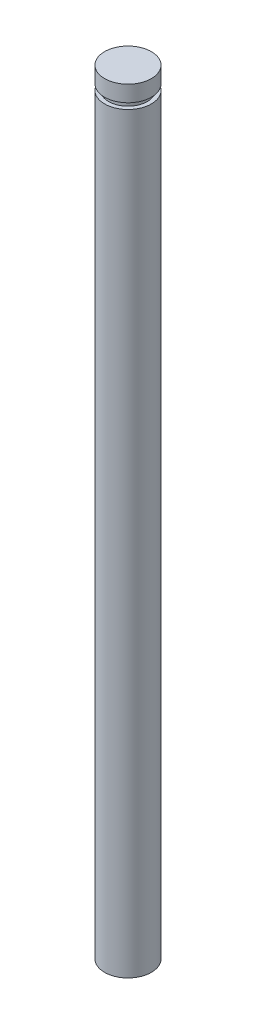
ISO-10303-21;
HEADER;
FILE_DESCRIPTION(('STEP AP214'),'2;1');
FILE_NAME('part.step','',(''),(''),'','','');
FILE_SCHEMA(('AUTOMOTIVE_DESIGN { 1 0 10303 214 1 1 1 1 }'));
ENDSEC;
DATA;
#1=APPLICATION_CONTEXT('core data for automotive mechanical design processes');
#2=APPLICATION_PROTOCOL_DEFINITION('international standard','automotive_design',2000,#1);
#3=PRODUCT_CONTEXT('',#1,'mechanical');
#4=PRODUCT('Part','Part','',(#3));
#5=PRODUCT_RELATED_PRODUCT_CATEGORY('part','',(#4));
#6=PRODUCT_DEFINITION_FORMATION('','',#4);
#7=PRODUCT_DEFINITION_CONTEXT('part definition',#1,'design');
#8=PRODUCT_DEFINITION('design','',#6,#7);
#9=PRODUCT_DEFINITION_SHAPE('','',#8);
#10=(LENGTH_UNIT() NAMED_UNIT(*) SI_UNIT(.MILLI.,.METRE.));
#11=(NAMED_UNIT(*) PLANE_ANGLE_UNIT() SI_UNIT($,.RADIAN.));
#12=(NAMED_UNIT(*) SI_UNIT($,.STERADIAN.) SOLID_ANGLE_UNIT());
#13=UNCERTAINTY_MEASURE_WITH_UNIT(LENGTH_MEASURE(1.E-05),#10,'distance_accuracy_value','');
#14=(GEOMETRIC_REPRESENTATION_CONTEXT(3) GLOBAL_UNCERTAINTY_ASSIGNED_CONTEXT((#13)) GLOBAL_UNIT_ASSIGNED_CONTEXT((#10,
#11,#12)) REPRESENTATION_CONTEXT('',''));
#15=CARTESIAN_POINT('',(0.,0.,0.));
#16=DIRECTION('',(0.,0.,1.));
#17=DIRECTION('',(1.,0.,0.));
#18=AXIS2_PLACEMENT_3D('',#15,#16,#17);
#19=CARTESIAN_POINT('',(0.,23.32,0.));
#20=DIRECTION('',(0.,1.,0.));
#21=DIRECTION('',(0.,0.,1.));
#22=AXIS2_PLACEMENT_3D('',#19,#20,#21);
#23=CYLINDRICAL_SURFACE('',#22,0.6);
#24=CARTESIAN_POINT('',(0.,23.32,0.));
#25=DIRECTION('',(0.,1.,0.));
#26=DIRECTION('',(0.,0.,1.));
#27=AXIS2_PLACEMENT_3D('',#24,#25,#26);
#28=CIRCLE('',#27,0.6);
#29=CARTESIAN_POINT('',(0.,23.32,0.6));
#30=VERTEX_POINT('',#29);
#31=EDGE_CURVE('E46',#30,#30,#28,.T.);
#32=ORIENTED_EDGE('',*,*,#31,.T.);
#33=EDGE_LOOP('',(#32));
#34=FACE_BOUND('',#33,.T.);
#35=CARTESIAN_POINT('',(0.,23.5,0.));
#36=DIRECTION('',(0.,1.,0.));
#37=DIRECTION('',(0.,0.,1.));
#38=AXIS2_PLACEMENT_3D('',#35,#36,#37);
#39=CIRCLE('',#38,0.6);
#40=CARTESIAN_POINT('',(0.,23.5,0.6));
#41=VERTEX_POINT('',#40);
#42=EDGE_CURVE('E56',#41,#41,#39,.T.);
#43=ORIENTED_EDGE('',*,*,#42,.F.);
#44=EDGE_LOOP('',(#43));
#45=FACE_BOUND('',#44,.T.);
#46=ADVANCED_FACE('F35',(#34,#45),#23,.T.);
#47=CARTESIAN_POINT('',(0.,24.,0.));
#48=DIRECTION('',(0.,-1.,0.));
#49=DIRECTION('',(0.,0.,-1.));
#50=AXIS2_PLACEMENT_3D('',#47,#48,#49);
#51=CYLINDRICAL_SURFACE('',#50,0.725);
#52=CARTESIAN_POINT('',(0.,0.,0.));
#53=DIRECTION('',(0.,1.,0.));
#54=DIRECTION('',(0.,0.,1.));
#55=AXIS2_PLACEMENT_3D('',#52,#53,#54);
#56=CIRCLE('',#55,0.725);
#57=CARTESIAN_POINT('',(0.,0.,0.725));
#58=VERTEX_POINT('',#57);
#59=EDGE_CURVE('E10',#58,#58,#56,.T.);
#60=ORIENTED_EDGE('',*,*,#59,.T.);
#61=EDGE_LOOP('',(#60));
#62=FACE_BOUND('',#61,.T.);
#63=CARTESIAN_POINT('',(0.,23.32,0.));
#64=DIRECTION('',(0.,1.,0.));
#65=DIRECTION('',(0.,0.,1.));
#66=AXIS2_PLACEMENT_3D('',#63,#64,#65);
#67=CIRCLE('',#66,0.725);
#68=CARTESIAN_POINT('',(0.,23.32,0.725));
#69=VERTEX_POINT('',#68);
#70=EDGE_CURVE('E42',#69,#69,#67,.T.);
#71=ORIENTED_EDGE('',*,*,#70,.F.);
#72=EDGE_LOOP('',(#71));
#73=FACE_BOUND('',#72,.T.);
#74=ADVANCED_FACE('F37',(#62,#73),#51,.T.);
#75=CARTESIAN_POINT('',(0.,0.,0.));
#76=DIRECTION('',(0.,1.,0.));
#77=DIRECTION('',(0.,0.,1.));
#78=AXIS2_PLACEMENT_3D('',#75,#76,#77);
#79=PLANE('',#78);
#80=ORIENTED_EDGE('',*,*,#59,.F.);
#81=EDGE_LOOP('',(#80));
#82=FACE_BOUND('',#81,.T.);
#83=ADVANCED_FACE('F71',(#82),#79,.F.);
#84=CARTESIAN_POINT('',(0.,23.32,0.));
#85=DIRECTION('',(0.,1.,0.));
#86=DIRECTION('',(0.,0.,1.));
#87=AXIS2_PLACEMENT_3D('',#84,#85,#86);
#88=PLANE('',#87);
#89=ORIENTED_EDGE('',*,*,#31,.F.);
#90=EDGE_LOOP('',(#89));
#91=FACE_BOUND('',#90,.T.);
#92=ORIENTED_EDGE('',*,*,#70,.T.);
#93=EDGE_LOOP('',(#92));
#94=FACE_BOUND('',#93,.T.);
#95=ADVANCED_FACE('F76',(#91,#94),#88,.T.);
#96=CARTESIAN_POINT('',(0.,23.5,0.));
#97=DIRECTION('',(0.,1.,0.));
#98=DIRECTION('',(0.,0.,1.));
#99=AXIS2_PLACEMENT_3D('',#96,#97,#98);
#100=CYLINDRICAL_SURFACE('',#99,0.725);
#101=CARTESIAN_POINT('',(0.,23.5,0.));
#102=DIRECTION('',(0.,1.,0.));
#103=DIRECTION('',(0.,0.,1.));
#104=AXIS2_PLACEMENT_3D('',#101,#102,#103);
#105=CIRCLE('',#104,0.725);
#106=CARTESIAN_POINT('',(0.,23.5,0.725));
#107=VERTEX_POINT('',#106);
#108=EDGE_CURVE('E50',#107,#107,#105,.T.);
#109=ORIENTED_EDGE('',*,*,#108,.T.);
#110=EDGE_LOOP('',(#109));
#111=FACE_BOUND('',#110,.T.);
#112=CARTESIAN_POINT('',(0.,24.,0.));
#113=DIRECTION('',(0.,1.,0.));
#114=DIRECTION('',(0.,0.,1.));
#115=AXIS2_PLACEMENT_3D('',#112,#113,#114);
#116=CIRCLE('',#115,0.725);
#117=CARTESIAN_POINT('',(0.,24.,0.725));
#118=VERTEX_POINT('',#117);
#119=EDGE_CURVE('E53',#118,#118,#116,.T.);
#120=ORIENTED_EDGE('',*,*,#119,.F.);
#121=EDGE_LOOP('',(#120));
#122=FACE_BOUND('',#121,.T.);
#123=ADVANCED_FACE('F74',(#111,#122),#100,.T.);
#124=CARTESIAN_POINT('',(0.,23.5,0.));
#125=DIRECTION('',(0.,1.,0.));
#126=DIRECTION('',(0.,0.,1.));
#127=AXIS2_PLACEMENT_3D('',#124,#125,#126);
#128=PLANE('',#127);
#129=ORIENTED_EDGE('',*,*,#42,.T.);
#130=EDGE_LOOP('',(#129));
#131=FACE_BOUND('',#130,.T.);
#132=ORIENTED_EDGE('',*,*,#108,.F.);
#133=EDGE_LOOP('',(#132));
#134=FACE_BOUND('',#133,.T.);
#135=ADVANCED_FACE('F62',(#131,#134),#128,.F.);
#136=CARTESIAN_POINT('',(0.,24.,0.));
#137=DIRECTION('',(0.,1.,0.));
#138=DIRECTION('',(0.,0.,1.));
#139=AXIS2_PLACEMENT_3D('',#136,#137,#138);
#140=PLANE('',#139);
#141=ORIENTED_EDGE('',*,*,#119,.T.);
#142=EDGE_LOOP('',(#141));
#143=FACE_BOUND('',#142,.T.);
#144=ADVANCED_FACE('F80',(#143),#140,.T.);
#145=CLOSED_SHELL('',(#46,#74,#83,#95,#123,#135,#144));
#146=MANIFOLD_SOLID_BREP('B2',#145);
#147=ADVANCED_BREP_SHAPE_REPRESENTATION('',(#18,#146),#14);
#148=SHAPE_DEFINITION_REPRESENTATION(#9,#147);
ENDSEC;
END-ISO-10303-21;
